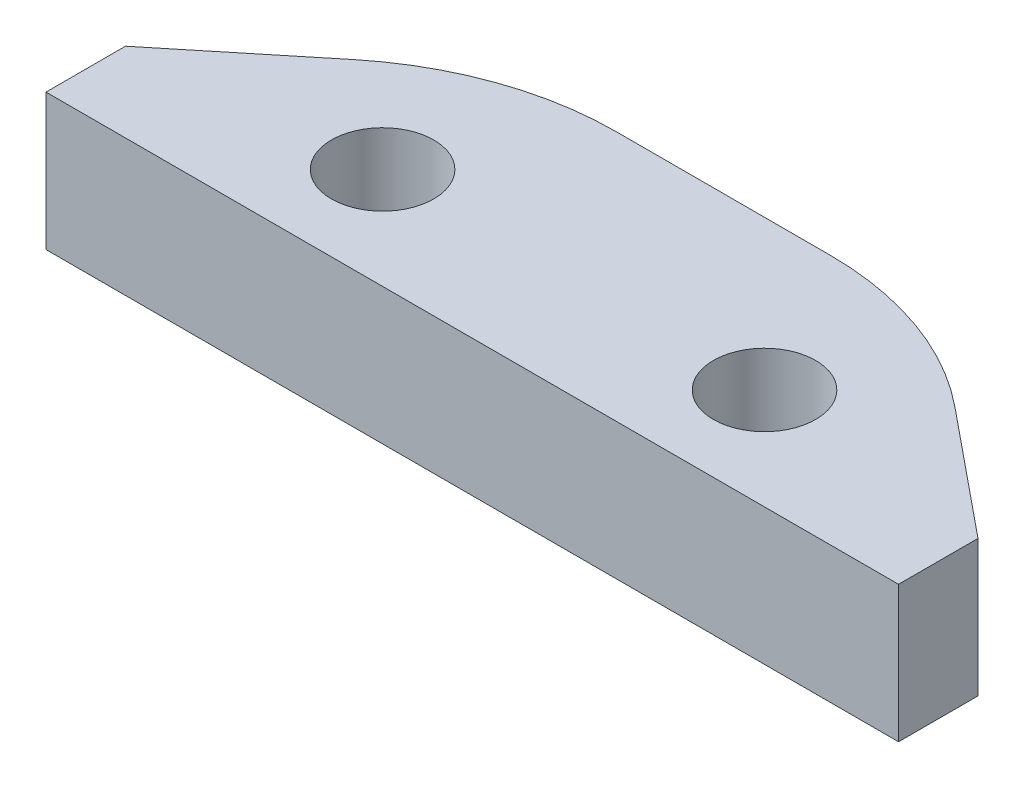
ISO-10303-21;
HEADER;
FILE_DESCRIPTION(('STEP AP214'),'2;1');
FILE_NAME('part.step','',(''),(''),'','','');
FILE_SCHEMA(('AUTOMOTIVE_DESIGN { 1 0 10303 214 1 1 1 1 }'));
ENDSEC;
DATA;
#1=APPLICATION_CONTEXT('core data for automotive mechanical design processes');
#2=APPLICATION_PROTOCOL_DEFINITION('international standard','automotive_design',2000,#1);
#3=PRODUCT_CONTEXT('',#1,'mechanical');
#4=PRODUCT('Part','Part','',(#3));
#5=PRODUCT_RELATED_PRODUCT_CATEGORY('part','',(#4));
#6=PRODUCT_DEFINITION_FORMATION('','',#4);
#7=PRODUCT_DEFINITION_CONTEXT('part definition',#1,'design');
#8=PRODUCT_DEFINITION('design','',#6,#7);
#9=PRODUCT_DEFINITION_SHAPE('','',#8);
#10=(LENGTH_UNIT() NAMED_UNIT(*) SI_UNIT(.MILLI.,.METRE.));
#11=(NAMED_UNIT(*) PLANE_ANGLE_UNIT() SI_UNIT($,.RADIAN.));
#12=(NAMED_UNIT(*) SI_UNIT($,.STERADIAN.) SOLID_ANGLE_UNIT());
#13=UNCERTAINTY_MEASURE_WITH_UNIT(LENGTH_MEASURE(1.E-05),#10,'distance_accuracy_value','');
#14=(GEOMETRIC_REPRESENTATION_CONTEXT(3) GLOBAL_UNCERTAINTY_ASSIGNED_CONTEXT((#13)) GLOBAL_UNIT_ASSIGNED_CONTEXT((#10,
#11,#12)) REPRESENTATION_CONTEXT('',''));
#15=CARTESIAN_POINT('',(0.,0.,0.));
#16=DIRECTION('',(0.,0.,1.));
#17=DIRECTION('',(1.,0.,0.));
#18=AXIS2_PLACEMENT_3D('',#15,#16,#17);
#19=CARTESIAN_POINT('',(12.5,4.,-1.165));
#20=DIRECTION('',(-1.,0.,0.));
#21=DIRECTION('',(0.,0.,1.));
#22=AXIS2_PLACEMENT_3D('',#19,#20,#21);
#23=PLANE('',#22);
#24=DIRECTION('',(0.,0.,-1.));
#25=VECTOR('',#24,1.);
#26=CARTESIAN_POINT('',(12.5,0.,-1.165));
#27=LINE('',#26,#25);
#28=CARTESIAN_POINT('',(12.5,0.,1.165));
#29=VERTEX_POINT('',#28);
#30=CARTESIAN_POINT('',(12.5,0.,-1.165));
#31=VERTEX_POINT('',#30);
#32=EDGE_CURVE('E118',#29,#31,#27,.T.);
#33=ORIENTED_EDGE('',*,*,#32,.T.);
#34=DIRECTION('',(0.,-1.,0.));
#35=VECTOR('',#34,1.);
#36=CARTESIAN_POINT('',(12.5,4.,-1.165));
#37=LINE('',#36,#35);
#38=CARTESIAN_POINT('',(12.5,4.,-1.165));
#39=VERTEX_POINT('',#38);
#40=EDGE_CURVE('E102',#39,#31,#37,.T.);
#41=ORIENTED_EDGE('',*,*,#40,.F.);
#42=DIRECTION('',(0.,0.,-1.));
#43=VECTOR('',#42,1.);
#44=CARTESIAN_POINT('',(12.5,4.,-1.165));
#45=LINE('',#44,#43);
#46=CARTESIAN_POINT('',(12.5,4.,1.165));
#47=VERTEX_POINT('',#46);
#48=EDGE_CURVE('E106',#47,#39,#45,.T.);
#49=ORIENTED_EDGE('',*,*,#48,.F.);
#50=DIRECTION('',(0.,-1.,0.));
#51=VECTOR('',#50,1.);
#52=CARTESIAN_POINT('',(12.5,4.,1.165));
#53=LINE('',#52,#51);
#54=EDGE_CURVE('E162',#47,#29,#53,.T.);
#55=ORIENTED_EDGE('',*,*,#54,.T.);
#56=EDGE_LOOP('',(#33,#41,#49,#55));
#57=FACE_BOUND('',#56,.T.);
#58=ADVANCED_FACE('F33',(#57),#23,.F.);
#59=CARTESIAN_POINT('',(6.34097322281371,4.,-6.18996990270829));
#60=DIRECTION('',(-0.632164546366289,0.,0.774834166978654));
#61=DIRECTION('',(0.774834166978654,0.,0.632164546366289));
#62=AXIS2_PLACEMENT_3D('',#59,#60,#61);
#63=PLANE('',#62);
#64=DIRECTION('',(-0.774834166978654,0.,-0.632164546366289));
#65=VECTOR('',#64,1.);
#66=CARTESIAN_POINT('',(6.34097322281371,0.,-6.18996990270829));
#67=LINE('',#66,#65);
#68=CARTESIAN_POINT('',(8.82481328467087,0.,-4.16347740551617));
#69=VERTEX_POINT('',#68);
#70=EDGE_CURVE('E149',#31,#69,#67,.T.);
#71=ORIENTED_EDGE('',*,*,#70,.T.);
#72=DIRECTION('',(0.,-1.,0.));
#73=VECTOR('',#72,1.);
#74=CARTESIAN_POINT('',(8.82481328467087,4.,-4.16347740551618));
#75=LINE('',#74,#73);
#76=CARTESIAN_POINT('',(8.82481328467087,4.,-4.16347740551617));
#77=VERTEX_POINT('',#76);
#78=EDGE_CURVE('E56',#69,#77,#75,.F.);
#79=ORIENTED_EDGE('',*,*,#78,.T.);
#80=DIRECTION('',(-0.774834166978654,0.,-0.632164546366289));
#81=VECTOR('',#80,1.);
#82=CARTESIAN_POINT('',(6.34097322281371,4.,-6.18996990270829));
#83=LINE('',#82,#81);
#84=EDGE_CURVE('E98',#39,#77,#83,.T.);
#85=ORIENTED_EDGE('',*,*,#84,.F.);
#86=ORIENTED_EDGE('',*,*,#40,.T.);
#87=EDGE_LOOP('',(#71,#79,#85,#86));
#88=FACE_BOUND('',#87,.T.);
#89=ADVANCED_FACE('F100',(#88),#63,.F.);
#90=CARTESIAN_POINT('',(-6.34097322281371,4.,-6.18996990270829));
#91=DIRECTION('',(0.,0.,1.));
#92=DIRECTION('',(1.,0.,0.));
#93=AXIS2_PLACEMENT_3D('',#90,#91,#92);
#94=PLANE('',#93);
#95=DIRECTION('',(-1.,0.,0.));
#96=VECTOR('',#95,1.);
#97=CARTESIAN_POINT('',(-6.34097322281371,4.,-6.18996990270829));
#98=LINE('',#97,#96);
#99=CARTESIAN_POINT('',(3.13533236737427,4.,-6.18996990270829));
#100=VERTEX_POINT('',#99);
#101=CARTESIAN_POINT('',(-3.13533236737428,4.,-6.18996990270829));
#102=VERTEX_POINT('',#101);
#103=EDGE_CURVE('E105',#100,#102,#98,.T.);
#104=ORIENTED_EDGE('',*,*,#103,.F.);
#105=DIRECTION('',(0.,-1.,0.));
#106=VECTOR('',#105,1.);
#107=CARTESIAN_POINT('',(3.13533236737427,4.,-6.18996990270829));
#108=LINE('',#107,#106);
#109=CARTESIAN_POINT('',(3.13533236737427,0.,-6.18996990270829));
#110=VERTEX_POINT('',#109);
#111=EDGE_CURVE('E122',#100,#110,#108,.T.);
#112=ORIENTED_EDGE('',*,*,#111,.T.);
#113=DIRECTION('',(-1.,0.,0.));
#114=VECTOR('',#113,1.);
#115=CARTESIAN_POINT('',(-6.34097322281371,0.,-6.18996990270829));
#116=LINE('',#115,#114);
#117=CARTESIAN_POINT('',(-3.13533236737428,0.,-6.18996990270829));
#118=VERTEX_POINT('',#117);
#119=EDGE_CURVE('E150',#110,#118,#116,.T.);
#120=ORIENTED_EDGE('',*,*,#119,.T.);
#121=DIRECTION('',(0.,-1.,0.));
#122=VECTOR('',#121,1.);
#123=CARTESIAN_POINT('',(-3.13533236737428,4.,-6.18996990270829));
#124=LINE('',#123,#122);
#125=EDGE_CURVE('E119',#118,#102,#124,.F.);
#126=ORIENTED_EDGE('',*,*,#125,.T.);
#127=EDGE_LOOP('',(#104,#112,#120,#126));
#128=FACE_BOUND('',#127,.T.);
#129=ADVANCED_FACE('F140',(#128),#94,.F.);
#130=CARTESIAN_POINT('',(-6.34097322281371,4.,-6.18996990270829));
#131=DIRECTION('',(0.632164546366287,0.,0.774834166978655));
#132=DIRECTION('',(0.774834166978655,0.,-0.632164546366287));
#133=AXIS2_PLACEMENT_3D('',#130,#131,#132);
#134=PLANE('',#133);
#135=DIRECTION('',(-0.774834166978655,0.,0.632164546366287));
#136=VECTOR('',#135,1.);
#137=CARTESIAN_POINT('',(-6.34097322281371,4.,-6.18996990270829));
#138=LINE('',#137,#136);
#139=CARTESIAN_POINT('',(-8.82481328467086,4.,-4.16347740551619));
#140=VERTEX_POINT('',#139);
#141=CARTESIAN_POINT('',(-12.5,4.,-1.165));
#142=VERTEX_POINT('',#141);
#143=EDGE_CURVE('E144',#140,#142,#138,.T.);
#144=ORIENTED_EDGE('',*,*,#143,.F.);
#145=DIRECTION('',(0.,-1.,0.));
#146=VECTOR('',#145,1.);
#147=CARTESIAN_POINT('',(-8.82481328467086,4.,-4.16347740551619));
#148=LINE('',#147,#146);
#149=CARTESIAN_POINT('',(-8.82481328467086,0.,-4.16347740551619));
#150=VERTEX_POINT('',#149);
#151=EDGE_CURVE('E11',#140,#150,#148,.T.);
#152=ORIENTED_EDGE('',*,*,#151,.T.);
#153=DIRECTION('',(-0.774834166978655,0.,0.632164546366287));
#154=VECTOR('',#153,1.);
#155=CARTESIAN_POINT('',(-6.34097322281371,0.,-6.18996990270829));
#156=LINE('',#155,#154);
#157=CARTESIAN_POINT('',(-12.5,0.,-1.165));
#158=VERTEX_POINT('',#157);
#159=EDGE_CURVE('E152',#150,#158,#156,.T.);
#160=ORIENTED_EDGE('',*,*,#159,.T.);
#161=DIRECTION('',(0.,-1.,0.));
#162=VECTOR('',#161,1.);
#163=CARTESIAN_POINT('',(-12.5,4.,-1.165));
#164=LINE('',#163,#162);
#165=EDGE_CURVE('E120',#142,#158,#164,.T.);
#166=ORIENTED_EDGE('',*,*,#165,.F.);
#167=EDGE_LOOP('',(#144,#152,#160,#166));
#168=FACE_BOUND('',#167,.T.);
#169=ADVANCED_FACE('F176',(#168),#134,.F.);
#170=CARTESIAN_POINT('',(-12.5,4.,-1.165));
#171=DIRECTION('',(1.,0.,0.));
#172=DIRECTION('',(0.,0.,-1.));
#173=AXIS2_PLACEMENT_3D('',#170,#171,#172);
#174=PLANE('',#173);
#175=DIRECTION('',(0.,0.,1.));
#176=VECTOR('',#175,1.);
#177=CARTESIAN_POINT('',(-12.5,0.,-1.165));
#178=LINE('',#177,#176);
#179=CARTESIAN_POINT('',(-12.5,0.,1.165));
#180=VERTEX_POINT('',#179);
#181=EDGE_CURVE('E159',#158,#180,#178,.T.);
#182=ORIENTED_EDGE('',*,*,#181,.T.);
#183=DIRECTION('',(0.,-1.,0.));
#184=VECTOR('',#183,1.);
#185=CARTESIAN_POINT('',(-12.5,4.,1.165));
#186=LINE('',#185,#184);
#187=CARTESIAN_POINT('',(-12.5,4.,1.165));
#188=VERTEX_POINT('',#187);
#189=EDGE_CURVE('E125',#188,#180,#186,.T.);
#190=ORIENTED_EDGE('',*,*,#189,.F.);
#191=DIRECTION('',(0.,0.,1.));
#192=VECTOR('',#191,1.);
#193=CARTESIAN_POINT('',(-12.5,4.,-1.165));
#194=LINE('',#193,#192);
#195=EDGE_CURVE('E174',#142,#188,#194,.T.);
#196=ORIENTED_EDGE('',*,*,#195,.F.);
#197=ORIENTED_EDGE('',*,*,#165,.T.);
#198=EDGE_LOOP('',(#182,#190,#196,#197));
#199=FACE_BOUND('',#198,.T.);
#200=ADVANCED_FACE('F172',(#199),#174,.F.);
#201=CARTESIAN_POINT('',(-12.5,4.,1.165));
#202=DIRECTION('',(0.,0.,-1.));
#203=DIRECTION('',(-1.,0.,0.));
#204=AXIS2_PLACEMENT_3D('',#201,#202,#203);
#205=PLANE('',#204);
#206=DIRECTION('',(1.,0.,0.));
#207=VECTOR('',#206,1.);
#208=CARTESIAN_POINT('',(-12.5,0.,1.165));
#209=LINE('',#208,#207);
#210=EDGE_CURVE('E115',#180,#29,#209,.T.);
#211=ORIENTED_EDGE('',*,*,#210,.T.);
#212=ORIENTED_EDGE('',*,*,#54,.F.);
#213=DIRECTION('',(1.,0.,0.));
#214=VECTOR('',#213,1.);
#215=CARTESIAN_POINT('',(-12.5,4.,1.165));
#216=LINE('',#215,#214);
#217=EDGE_CURVE('E111',#188,#47,#216,.T.);
#218=ORIENTED_EDGE('',*,*,#217,.F.);
#219=ORIENTED_EDGE('',*,*,#189,.T.);
#220=EDGE_LOOP('',(#211,#212,#218,#219));
#221=FACE_BOUND('',#220,.T.);
#222=ADVANCED_FACE('F167',(#221),#205,.F.);
#223=CARTESIAN_POINT('',(0.,4.,0.));
#224=DIRECTION('',(0.,1.,0.));
#225=DIRECTION('',(0.,0.,1.));
#226=AXIS2_PLACEMENT_3D('',#223,#224,#225);
#227=PLANE('',#226);
#228=CARTESIAN_POINT('',(5.6,4.,-1.805));
#229=DIRECTION('',(0.,1.,0.));
#230=DIRECTION('',(0.,0.,1.));
#231=AXIS2_PLACEMENT_3D('',#228,#229,#230);
#232=CIRCLE('',#231,1.5);
#233=CARTESIAN_POINT('',(5.6,4.,-0.305000000000004));
#234=VERTEX_POINT('',#233);
#235=EDGE_CURVE('E219',#234,#234,#232,.T.);
#236=ORIENTED_EDGE('',*,*,#235,.F.);
#237=EDGE_LOOP('',(#236));
#238=FACE_BOUND('',#237,.T.);
#239=CARTESIAN_POINT('',(-5.6,4.,-1.805));
#240=DIRECTION('',(0.,1.,0.));
#241=DIRECTION('',(0.,0.,1.));
#242=AXIS2_PLACEMENT_3D('',#239,#240,#241);
#243=CIRCLE('',#242,1.5);
#244=CARTESIAN_POINT('',(-5.6,4.,-0.305000000000001));
#245=VERTEX_POINT('',#244);
#246=EDGE_CURVE('E221',#245,#245,#243,.T.);
#247=ORIENTED_EDGE('',*,*,#246,.F.);
#248=EDGE_LOOP('',(#247));
#249=FACE_BOUND('',#248,.T.);
#250=ORIENTED_EDGE('',*,*,#84,.T.);
#251=CARTESIAN_POINT('',(3.13533236737427,4.,2.81003009729171));
#252=DIRECTION('',(0.,1.,0.));
#253=DIRECTION('',(0.,0.,1.));
#254=AXIS2_PLACEMENT_3D('',#251,#252,#253);
#255=CIRCLE('',#254,9.);
#256=EDGE_CURVE('E41',#77,#100,#255,.T.);
#257=ORIENTED_EDGE('',*,*,#256,.T.);
#258=ORIENTED_EDGE('',*,*,#103,.T.);
#259=CARTESIAN_POINT('',(-3.13533236737428,4.,2.81003009729171));
#260=DIRECTION('',(0.,1.,0.));
#261=DIRECTION('',(0.,0.,1.));
#262=AXIS2_PLACEMENT_3D('',#259,#260,#261);
#263=CIRCLE('',#262,9.);
#264=EDGE_CURVE('E48',#102,#140,#263,.T.);
#265=ORIENTED_EDGE('',*,*,#264,.T.);
#266=ORIENTED_EDGE('',*,*,#143,.T.);
#267=ORIENTED_EDGE('',*,*,#195,.T.);
#268=ORIENTED_EDGE('',*,*,#217,.T.);
#269=ORIENTED_EDGE('',*,*,#48,.T.);
#270=EDGE_LOOP('',(#250,#257,#258,#265,#266,#267,#268,#269));
#271=FACE_BOUND('',#270,.T.);
#272=ADVANCED_FACE('F109',(#238,#249,#271),#227,.T.);
#273=CARTESIAN_POINT('',(0.,0.,0.));
#274=DIRECTION('',(0.,1.,0.));
#275=DIRECTION('',(0.,0.,1.));
#276=AXIS2_PLACEMENT_3D('',#273,#274,#275);
#277=PLANE('',#276);
#278=CARTESIAN_POINT('',(5.6,0.,-1.805));
#279=DIRECTION('',(0.,1.,0.));
#280=DIRECTION('',(0.,0.,1.));
#281=AXIS2_PLACEMENT_3D('',#278,#279,#280);
#282=CIRCLE('',#281,1.5);
#283=CARTESIAN_POINT('',(5.6,0.,-0.305000000000004));
#284=VERTEX_POINT('',#283);
#285=EDGE_CURVE('E216',#284,#284,#282,.T.);
#286=ORIENTED_EDGE('',*,*,#285,.T.);
#287=EDGE_LOOP('',(#286));
#288=FACE_BOUND('',#287,.T.);
#289=CARTESIAN_POINT('',(-5.6,0.,-1.805));
#290=DIRECTION('',(0.,1.,0.));
#291=DIRECTION('',(0.,0.,1.));
#292=AXIS2_PLACEMENT_3D('',#289,#290,#291);
#293=CIRCLE('',#292,1.5);
#294=CARTESIAN_POINT('',(-5.6,0.,-0.305000000000001));
#295=VERTEX_POINT('',#294);
#296=EDGE_CURVE('E154',#295,#295,#293,.T.);
#297=ORIENTED_EDGE('',*,*,#296,.T.);
#298=EDGE_LOOP('',(#297));
#299=FACE_BOUND('',#298,.T.);
#300=ORIENTED_EDGE('',*,*,#119,.F.);
#301=CARTESIAN_POINT('',(3.13533236737427,0.,2.81003009729171));
#302=DIRECTION('',(0.,1.,0.));
#303=DIRECTION('',(0.,0.,1.));
#304=AXIS2_PLACEMENT_3D('',#301,#302,#303);
#305=CIRCLE('',#304,9.);
#306=EDGE_CURVE('E133',#110,#69,#305,.F.);
#307=ORIENTED_EDGE('',*,*,#306,.T.);
#308=ORIENTED_EDGE('',*,*,#70,.F.);
#309=ORIENTED_EDGE('',*,*,#32,.F.);
#310=ORIENTED_EDGE('',*,*,#210,.F.);
#311=ORIENTED_EDGE('',*,*,#181,.F.);
#312=ORIENTED_EDGE('',*,*,#159,.F.);
#313=CARTESIAN_POINT('',(-3.13533236737428,0.,2.81003009729171));
#314=DIRECTION('',(0.,1.,0.));
#315=DIRECTION('',(0.,0.,1.));
#316=AXIS2_PLACEMENT_3D('',#313,#314,#315);
#317=CIRCLE('',#316,9.);
#318=EDGE_CURVE('E131',#150,#118,#317,.F.);
#319=ORIENTED_EDGE('',*,*,#318,.T.);
#320=EDGE_LOOP('',(#300,#307,#308,#309,#310,#311,#312,#319));
#321=FACE_BOUND('',#320,.T.);
#322=ADVANCED_FACE('F148',(#288,#299,#321),#277,.F.);
#323=CARTESIAN_POINT('',(3.13533236737427,4.,2.81003009729171));
#324=DIRECTION('',(0.,-1.,0.));
#325=DIRECTION('',(0.,0.,-1.));
#326=AXIS2_PLACEMENT_3D('',#323,#324,#325);
#327=CYLINDRICAL_SURFACE('',#326,9.);
#328=ORIENTED_EDGE('',*,*,#256,.F.);
#329=ORIENTED_EDGE('',*,*,#78,.F.);
#330=ORIENTED_EDGE('',*,*,#306,.F.);
#331=ORIENTED_EDGE('',*,*,#111,.F.);
#332=EDGE_LOOP('',(#328,#329,#330,#331));
#333=FACE_BOUND('',#332,.T.);
#334=ADVANCED_FACE('F146',(#333),#327,.T.);
#335=CARTESIAN_POINT('',(-3.13533236737428,4.,2.81003009729171));
#336=DIRECTION('',(0.,-1.,0.));
#337=DIRECTION('',(0.,0.,-1.));
#338=AXIS2_PLACEMENT_3D('',#335,#336,#337);
#339=CYLINDRICAL_SURFACE('',#338,9.);
#340=ORIENTED_EDGE('',*,*,#264,.F.);
#341=ORIENTED_EDGE('',*,*,#125,.F.);
#342=ORIENTED_EDGE('',*,*,#318,.F.);
#343=ORIENTED_EDGE('',*,*,#151,.F.);
#344=EDGE_LOOP('',(#340,#341,#342,#343));
#345=FACE_BOUND('',#344,.T.);
#346=ADVANCED_FACE('F35',(#345),#339,.T.);
#347=CARTESIAN_POINT('',(-5.6,0.,-1.805));
#348=DIRECTION('',(0.,1.,0.));
#349=DIRECTION('',(0.,0.,1.));
#350=AXIS2_PLACEMENT_3D('',#347,#348,#349);
#351=CYLINDRICAL_SURFACE('',#350,1.5);
#352=ORIENTED_EDGE('',*,*,#296,.F.);
#353=EDGE_LOOP('',(#352));
#354=FACE_BOUND('',#353,.T.);
#355=ORIENTED_EDGE('',*,*,#246,.T.);
#356=EDGE_LOOP('',(#355));
#357=FACE_BOUND('',#356,.T.);
#358=ADVANCED_FACE('F180',(#354,#357),#351,.F.);
#359=CARTESIAN_POINT('',(5.6,0.,-1.805));
#360=DIRECTION('',(0.,1.,0.));
#361=DIRECTION('',(0.,0.,1.));
#362=AXIS2_PLACEMENT_3D('',#359,#360,#361);
#363=CYLINDRICAL_SURFACE('',#362,1.5);
#364=ORIENTED_EDGE('',*,*,#285,.F.);
#365=EDGE_LOOP('',(#364));
#366=FACE_BOUND('',#365,.T.);
#367=ORIENTED_EDGE('',*,*,#235,.T.);
#368=EDGE_LOOP('',(#367));
#369=FACE_BOUND('',#368,.T.);
#370=ADVANCED_FACE('F185',(#366,#369),#363,.F.);
#371=CLOSED_SHELL('',(#58,#89,#129,#169,#200,#222,#272,#322,#334,#346,#358,#370));
#372=MANIFOLD_SOLID_BREP('B2',#371);
#373=ADVANCED_BREP_SHAPE_REPRESENTATION('',(#18,#372),#14);
#374=SHAPE_DEFINITION_REPRESENTATION(#9,#373);
ENDSEC;
END-ISO-10303-21;
